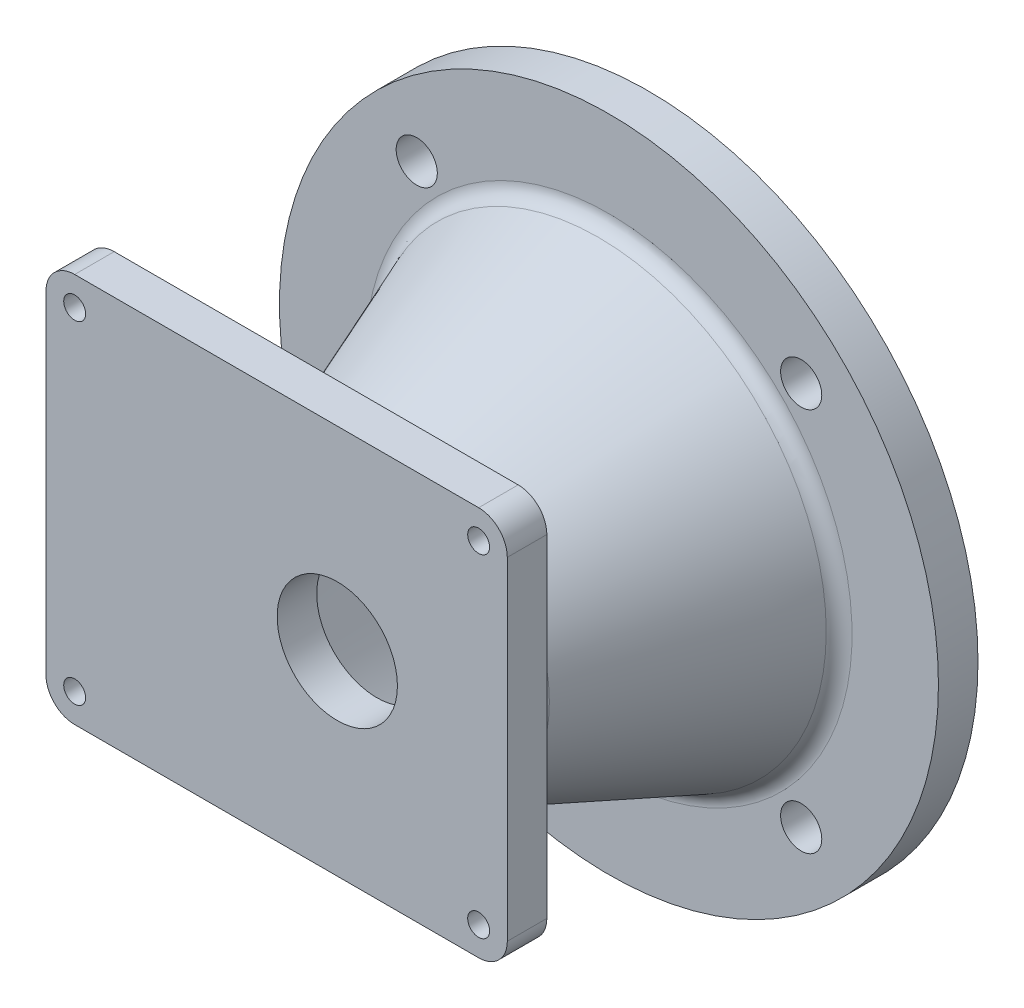
ISO-10303-21;
HEADER;
FILE_DESCRIPTION(('STEP AP214'),'2;1');
FILE_NAME('part.step','',(''),(''),'','','');
FILE_SCHEMA(('AUTOMOTIVE_DESIGN { 1 0 10303 214 1 1 1 1 }'));
ENDSEC;
DATA;
#1=APPLICATION_CONTEXT('core data for automotive mechanical design processes');
#2=APPLICATION_PROTOCOL_DEFINITION('international standard','automotive_design',2000,#1);
#3=PRODUCT_CONTEXT('',#1,'mechanical');
#4=PRODUCT('Part','Part','',(#3));
#5=PRODUCT_RELATED_PRODUCT_CATEGORY('part','',(#4));
#6=PRODUCT_DEFINITION_FORMATION('','',#4);
#7=PRODUCT_DEFINITION_CONTEXT('part definition',#1,'design');
#8=PRODUCT_DEFINITION('design','',#6,#7);
#9=PRODUCT_DEFINITION_SHAPE('','',#8);
#10=(LENGTH_UNIT() NAMED_UNIT(*) SI_UNIT(.MILLI.,.METRE.));
#11=(NAMED_UNIT(*) PLANE_ANGLE_UNIT() SI_UNIT($,.RADIAN.));
#12=(NAMED_UNIT(*) SI_UNIT($,.STERADIAN.) SOLID_ANGLE_UNIT());
#13=UNCERTAINTY_MEASURE_WITH_UNIT(LENGTH_MEASURE(1.E-05),#10,'distance_accuracy_value','');
#14=(GEOMETRIC_REPRESENTATION_CONTEXT(3) GLOBAL_UNCERTAINTY_ASSIGNED_CONTEXT((#13)) GLOBAL_UNIT_ASSIGNED_CONTEXT((#10,
#11,#12)) REPRESENTATION_CONTEXT('',''));
#15=CARTESIAN_POINT('',(0.,0.,0.));
#16=DIRECTION('',(0.,0.,1.));
#17=DIRECTION('',(1.,0.,0.));
#18=AXIS2_PLACEMENT_3D('',#15,#16,#17);
#19=CARTESIAN_POINT('',(125.399999999988,50.4499999999997,94.4500000000136));
#20=DIRECTION('',(0.,0.,-1.));
#21=DIRECTION('',(-1.,0.,0.));
#22=AXIS2_PLACEMENT_3D('',#19,#20,#21);
#23=CYLINDRICAL_SURFACE('',#22,8.69999999999994);
#24=CARTESIAN_POINT('',(125.399999999988,50.4499999999997,94.4500000000136));
#25=DIRECTION('',(0.,0.,-1.));
#26=DIRECTION('',(-1.,0.,0.));
#27=AXIS2_PLACEMENT_3D('',#24,#25,#26);
#28=CIRCLE('',#27,8.69999999999994);
#29=CARTESIAN_POINT('',(134.099999999988,50.4499999999997,94.4500000000136));
#30=VERTEX_POINT('',#29);
#31=CARTESIAN_POINT('',(125.399999999988,59.1499999999996,94.4500000000136));
#32=VERTEX_POINT('',#31);
#33=EDGE_CURVE('E21',#30,#32,#28,.F.);
#34=ORIENTED_EDGE('',*,*,#33,.F.);
#35=DIRECTION('',(0.,0.,-1.));
#36=VECTOR('',#35,1.);
#37=CARTESIAN_POINT('',(134.099999999988,50.4499999999997,94.4500000000136));
#38=LINE('',#37,#36);
#39=CARTESIAN_POINT('',(134.099999999988,50.4499999999997,82.4500000000136));
#40=VERTEX_POINT('',#39);
#41=EDGE_CURVE('E79',#40,#30,#38,.F.);
#42=ORIENTED_EDGE('',*,*,#41,.F.);
#43=CARTESIAN_POINT('',(125.399999999988,50.4499999999997,82.4500000000137));
#44=DIRECTION('',(0.,0.,-1.));
#45=DIRECTION('',(-1.,0.,0.));
#46=AXIS2_PLACEMENT_3D('',#43,#44,#45);
#47=CIRCLE('',#46,8.69999999999994);
#48=CARTESIAN_POINT('',(125.399999999988,59.1499999999996,82.4500000000136));
#49=VERTEX_POINT('',#48);
#50=EDGE_CURVE('E89',#49,#40,#47,.T.);
#51=ORIENTED_EDGE('',*,*,#50,.F.);
#52=DIRECTION('',(0.,0.,1.));
#53=VECTOR('',#52,1.);
#54=CARTESIAN_POINT('',(125.399999999988,59.1499999999996,94.4500000000136));
#55=LINE('',#54,#53);
#56=EDGE_CURVE('E84',#32,#49,#55,.F.);
#57=ORIENTED_EDGE('',*,*,#56,.F.);
#58=EDGE_LOOP('',(#34,#42,#51,#57));
#59=FACE_BOUND('',#58,.T.);
#60=ADVANCED_FACE('F17',(#59),#23,.T.);
#61=CARTESIAN_POINT('',(134.099999999988,-50.4499999999997,94.4500000000136));
#62=DIRECTION('',(1.,0.,0.));
#63=DIRECTION('',(0.,0.,-1.));
#64=AXIS2_PLACEMENT_3D('',#61,#62,#63);
#65=PLANE('',#64);
#66=DIRECTION('',(0.,1.,0.));
#67=VECTOR('',#66,1.);
#68=CARTESIAN_POINT('',(134.099999999988,0.,94.4500000000136));
#69=LINE('',#68,#67);
#70=CARTESIAN_POINT('',(134.099999999988,-50.4499999999997,94.4500000000136));
#71=VERTEX_POINT('',#70);
#72=EDGE_CURVE('E92',#71,#30,#69,.T.);
#73=ORIENTED_EDGE('',*,*,#72,.F.);
#74=DIRECTION('',(0.,0.,-1.));
#75=VECTOR('',#74,1.);
#76=CARTESIAN_POINT('',(134.099999999988,-50.4499999999997,94.4500000000136));
#77=LINE('',#76,#75);
#78=CARTESIAN_POINT('',(134.099999999988,-50.4499999999997,82.4500000000136));
#79=VERTEX_POINT('',#78);
#80=EDGE_CURVE('E116',#79,#71,#77,.F.);
#81=ORIENTED_EDGE('',*,*,#80,.F.);
#82=DIRECTION('',(0.,1.,0.));
#83=VECTOR('',#82,1.);
#84=CARTESIAN_POINT('',(134.099999999988,0.,82.4500000000136));
#85=LINE('',#84,#83);
#86=EDGE_CURVE('E191',#40,#79,#85,.F.);
#87=ORIENTED_EDGE('',*,*,#86,.F.);
#88=ORIENTED_EDGE('',*,*,#41,.T.);
#89=EDGE_LOOP('',(#73,#81,#87,#88));
#90=FACE_BOUND('',#89,.T.);
#91=ADVANCED_FACE('F328',(#90),#65,.T.);
#92=CARTESIAN_POINT('',(125.399999999988,-50.4499999999997,94.4500000000136));
#93=DIRECTION('',(0.,0.,-1.));
#94=DIRECTION('',(-1.,0.,0.));
#95=AXIS2_PLACEMENT_3D('',#92,#93,#94);
#96=CYLINDRICAL_SURFACE('',#95,8.69999999999994);
#97=CARTESIAN_POINT('',(125.399999999988,-50.4499999999997,94.4500000000136));
#98=DIRECTION('',(0.,0.,-1.));
#99=DIRECTION('',(-1.,0.,0.));
#100=AXIS2_PLACEMENT_3D('',#97,#98,#99);
#101=CIRCLE('',#100,8.69999999999994);
#102=CARTESIAN_POINT('',(125.399999999988,-59.1499999999996,94.4500000000136));
#103=VERTEX_POINT('',#102);
#104=EDGE_CURVE('E205',#103,#71,#101,.F.);
#105=ORIENTED_EDGE('',*,*,#104,.F.);
#106=DIRECTION('',(0.,0.,-1.));
#107=VECTOR('',#106,1.);
#108=CARTESIAN_POINT('',(125.399999999988,-59.1499999999996,94.4500000000136));
#109=LINE('',#108,#107);
#110=CARTESIAN_POINT('',(125.399999999988,-59.1499999999996,82.4500000000136));
#111=VERTEX_POINT('',#110);
#112=EDGE_CURVE('E114',#111,#103,#109,.F.);
#113=ORIENTED_EDGE('',*,*,#112,.F.);
#114=CARTESIAN_POINT('',(125.399999999988,-50.4499999999997,82.4500000000137));
#115=DIRECTION('',(0.,0.,-1.));
#116=DIRECTION('',(-1.,0.,0.));
#117=AXIS2_PLACEMENT_3D('',#114,#115,#116);
#118=CIRCLE('',#117,8.69999999999994);
#119=EDGE_CURVE('E188',#79,#111,#118,.T.);
#120=ORIENTED_EDGE('',*,*,#119,.F.);
#121=ORIENTED_EDGE('',*,*,#80,.T.);
#122=EDGE_LOOP('',(#105,#113,#120,#121));
#123=FACE_BOUND('',#122,.T.);
#124=ADVANCED_FACE('F331',(#123),#96,.T.);
#125=CARTESIAN_POINT('',(2.79999999998868,-59.1499999999996,94.4500000000136));
#126=DIRECTION('',(0.,-1.,0.));
#127=DIRECTION('',(0.,0.,-1.));
#128=AXIS2_PLACEMENT_3D('',#125,#126,#127);
#129=PLANE('',#128);
#130=DIRECTION('',(1.,0.,0.));
#131=VECTOR('',#130,1.);
#132=CARTESIAN_POINT('',(64.0999999999883,-59.1499999999996,94.4500000000136));
#133=LINE('',#132,#131);
#134=CARTESIAN_POINT('',(2.79999999998868,-59.1499999999996,94.4500000000136));
#135=VERTEX_POINT('',#134);
#136=EDGE_CURVE('E207',#135,#103,#133,.T.);
#137=ORIENTED_EDGE('',*,*,#136,.F.);
#138=DIRECTION('',(0.,0.,-1.));
#139=VECTOR('',#138,1.);
#140=CARTESIAN_POINT('',(2.79999999998868,-59.1499999999997,94.4500000000136));
#141=LINE('',#140,#139);
#142=CARTESIAN_POINT('',(2.79999999998868,-59.1499999999996,82.4500000000136));
#143=VERTEX_POINT('',#142);
#144=EDGE_CURVE('E112',#143,#135,#141,.F.);
#145=ORIENTED_EDGE('',*,*,#144,.F.);
#146=DIRECTION('',(-1.,0.,0.));
#147=VECTOR('',#146,1.);
#148=CARTESIAN_POINT('',(64.0999999999883,-59.1499999999996,82.4500000000136));
#149=LINE('',#148,#147);
#150=EDGE_CURVE('E187',#111,#143,#149,.T.);
#151=ORIENTED_EDGE('',*,*,#150,.F.);
#152=ORIENTED_EDGE('',*,*,#112,.T.);
#153=EDGE_LOOP('',(#137,#145,#151,#152));
#154=FACE_BOUND('',#153,.T.);
#155=ADVANCED_FACE('F334',(#154),#129,.T.);
#156=CARTESIAN_POINT('',(2.79999999998868,-50.4499999999997,94.4500000000136));
#157=DIRECTION('',(0.,0.,-1.));
#158=DIRECTION('',(-1.,0.,0.));
#159=AXIS2_PLACEMENT_3D('',#156,#157,#158);
#160=CYLINDRICAL_SURFACE('',#159,8.69999999999994);
#161=CARTESIAN_POINT('',(2.79999999998868,-50.4499999999997,94.4500000000136));
#162=DIRECTION('',(0.,0.,-1.));
#163=DIRECTION('',(-1.,0.,0.));
#164=AXIS2_PLACEMENT_3D('',#161,#162,#163);
#165=CIRCLE('',#164,8.69999999999994);
#166=CARTESIAN_POINT('',(-5.90000000001123,-50.4499999999997,94.4500000000136));
#167=VERTEX_POINT('',#166);
#168=EDGE_CURVE('E208',#167,#135,#165,.F.);
#169=ORIENTED_EDGE('',*,*,#168,.F.);
#170=DIRECTION('',(0.,0.,1.));
#171=VECTOR('',#170,1.);
#172=CARTESIAN_POINT('',(-5.90000000001123,-50.4499999999997,94.4500000000136));
#173=LINE('',#172,#171);
#174=CARTESIAN_POINT('',(-5.90000000001125,-50.4499999999997,82.4500000000136));
#175=VERTEX_POINT('',#174);
#176=EDGE_CURVE('E110',#175,#167,#173,.T.);
#177=ORIENTED_EDGE('',*,*,#176,.F.);
#178=CARTESIAN_POINT('',(2.79999999998868,-50.4499999999997,82.4500000000137));
#179=DIRECTION('',(0.,0.,-1.));
#180=DIRECTION('',(-1.,0.,0.));
#181=AXIS2_PLACEMENT_3D('',#178,#179,#180);
#182=CIRCLE('',#181,8.69999999999994);
#183=EDGE_CURVE('E184',#143,#175,#182,.T.);
#184=ORIENTED_EDGE('',*,*,#183,.F.);
#185=ORIENTED_EDGE('',*,*,#144,.T.);
#186=EDGE_LOOP('',(#169,#177,#184,#185));
#187=FACE_BOUND('',#186,.T.);
#188=ADVANCED_FACE('F338',(#187),#160,.T.);
#189=CARTESIAN_POINT('',(-5.90000000001123,50.4499999999997,94.4500000000136));
#190=DIRECTION('',(-1.,0.,0.));
#191=DIRECTION('',(0.,0.,1.));
#192=AXIS2_PLACEMENT_3D('',#189,#190,#191);
#193=PLANE('',#192);
#194=DIRECTION('',(0.,1.,0.));
#195=VECTOR('',#194,1.);
#196=CARTESIAN_POINT('',(-5.90000000001123,0.,94.4500000000136));
#197=LINE('',#196,#195);
#198=CARTESIAN_POINT('',(-5.90000000001123,50.4499999999997,94.4500000000136));
#199=VERTEX_POINT('',#198);
#200=EDGE_CURVE('E210',#199,#167,#197,.F.);
#201=ORIENTED_EDGE('',*,*,#200,.F.);
#202=DIRECTION('',(0.,0.,-1.));
#203=VECTOR('',#202,1.);
#204=CARTESIAN_POINT('',(-5.90000000001123,50.4499999999997,94.4500000000136));
#205=LINE('',#204,#203);
#206=CARTESIAN_POINT('',(-5.90000000001125,50.4499999999997,82.4500000000136));
#207=VERTEX_POINT('',#206);
#208=EDGE_CURVE('E107',#207,#199,#205,.F.);
#209=ORIENTED_EDGE('',*,*,#208,.F.);
#210=DIRECTION('',(0.,1.,0.));
#211=VECTOR('',#210,1.);
#212=CARTESIAN_POINT('',(-5.90000000001126,0.,82.4500000000136));
#213=LINE('',#212,#211);
#214=EDGE_CURVE('E183',#175,#207,#213,.T.);
#215=ORIENTED_EDGE('',*,*,#214,.F.);
#216=ORIENTED_EDGE('',*,*,#176,.T.);
#217=EDGE_LOOP('',(#201,#209,#215,#216));
#218=FACE_BOUND('',#217,.T.);
#219=ADVANCED_FACE('F342',(#218),#193,.T.);
#220=CARTESIAN_POINT('',(2.79999999998871,50.4499999999997,94.4500000000136));
#221=DIRECTION('',(0.,0.,-1.));
#222=DIRECTION('',(-1.,0.,0.));
#223=AXIS2_PLACEMENT_3D('',#220,#221,#222);
#224=CYLINDRICAL_SURFACE('',#223,8.69999999999994);
#225=CARTESIAN_POINT('',(2.79999999998871,50.4499999999997,94.4500000000136));
#226=DIRECTION('',(0.,0.,-1.));
#227=DIRECTION('',(-1.,0.,0.));
#228=AXIS2_PLACEMENT_3D('',#225,#226,#227);
#229=CIRCLE('',#228,8.69999999999994);
#230=CARTESIAN_POINT('',(2.79999999998871,59.1499999999996,94.4500000000136));
#231=VERTEX_POINT('',#230);
#232=EDGE_CURVE('E99',#231,#199,#229,.F.);
#233=ORIENTED_EDGE('',*,*,#232,.F.);
#234=DIRECTION('',(0.,0.,1.));
#235=VECTOR('',#234,1.);
#236=CARTESIAN_POINT('',(2.79999999998871,59.1499999999996,94.4500000000136));
#237=LINE('',#236,#235);
#238=CARTESIAN_POINT('',(2.79999999998871,59.1499999999996,82.4500000000136));
#239=VERTEX_POINT('',#238);
#240=EDGE_CURVE('E36',#239,#231,#237,.T.);
#241=ORIENTED_EDGE('',*,*,#240,.F.);
#242=CARTESIAN_POINT('',(2.79999999998871,50.4499999999997,82.4500000000136));
#243=DIRECTION('',(0.,0.,-1.));
#244=DIRECTION('',(-1.,0.,0.));
#245=AXIS2_PLACEMENT_3D('',#242,#243,#244);
#246=CIRCLE('',#245,8.69999999999994);
#247=EDGE_CURVE('E180',#207,#239,#246,.T.);
#248=ORIENTED_EDGE('',*,*,#247,.F.);
#249=ORIENTED_EDGE('',*,*,#208,.T.);
#250=EDGE_LOOP('',(#233,#241,#248,#249));
#251=FACE_BOUND('',#250,.T.);
#252=ADVANCED_FACE('F346',(#251),#224,.T.);
#253=CARTESIAN_POINT('',(125.399999999988,59.1499999999996,94.4500000000136));
#254=DIRECTION('',(0.,1.,0.));
#255=DIRECTION('',(0.,0.,1.));
#256=AXIS2_PLACEMENT_3D('',#253,#254,#255);
#257=PLANE('',#256);
#258=DIRECTION('',(1.,0.,0.));
#259=VECTOR('',#258,1.);
#260=CARTESIAN_POINT('',(64.0999999999883,59.1499999999996,94.4500000000136));
#261=LINE('',#260,#259);
#262=EDGE_CURVE('E95',#32,#231,#261,.F.);
#263=ORIENTED_EDGE('',*,*,#262,.F.);
#264=ORIENTED_EDGE('',*,*,#56,.T.);
#265=DIRECTION('',(-1.,0.,0.));
#266=VECTOR('',#265,1.);
#267=CARTESIAN_POINT('',(64.0999999999883,59.1499999999996,82.4500000000136));
#268=LINE('',#267,#266);
#269=EDGE_CURVE('E179',#239,#49,#268,.F.);
#270=ORIENTED_EDGE('',*,*,#269,.F.);
#271=ORIENTED_EDGE('',*,*,#240,.T.);
#272=EDGE_LOOP('',(#263,#264,#270,#271));
#273=FACE_BOUND('',#272,.T.);
#274=ADVANCED_FACE('F96',(#273),#257,.T.);
#275=CARTESIAN_POINT('',(2.79999999998871,50.4499999999997,82.4500000000136));
#276=DIRECTION('',(0.,0.,1.));
#277=DIRECTION('',(1.,0.,0.));
#278=AXIS2_PLACEMENT_3D('',#275,#276,#277);
#279=CYLINDRICAL_SURFACE('',#278,3.32349999999999);
#280=CARTESIAN_POINT('',(2.79999999998871,50.4499999999997,94.4500000000136));
#281=DIRECTION('',(0.,0.,1.));
#282=DIRECTION('',(1.,0.,0.));
#283=AXIS2_PLACEMENT_3D('',#280,#281,#282);
#284=CIRCLE('',#283,3.32349999999999);
#285=CARTESIAN_POINT('',(6.1234999999887,50.4499999999997,94.4500000000136));
#286=VERTEX_POINT('',#285);
#287=EDGE_CURVE('E202',#286,#286,#284,.F.);
#288=ORIENTED_EDGE('',*,*,#287,.F.);
#289=EDGE_LOOP('',(#288));
#290=FACE_BOUND('',#289,.T.);
#291=CARTESIAN_POINT('',(2.79999999998871,50.4499999999997,82.4500000000136));
#292=DIRECTION('',(0.,0.,1.));
#293=DIRECTION('',(1.,0.,0.));
#294=AXIS2_PLACEMENT_3D('',#291,#292,#293);
#295=CIRCLE('',#294,3.32349999999999);
#296=CARTESIAN_POINT('',(6.1234999999887,50.4499999999997,82.4500000000136));
#297=VERTEX_POINT('',#296);
#298=EDGE_CURVE('E176',#297,#297,#295,.T.);
#299=ORIENTED_EDGE('',*,*,#298,.F.);
#300=EDGE_LOOP('',(#299));
#301=FACE_BOUND('',#300,.T.);
#302=ADVANCED_FACE('F321',(#290,#301),#279,.F.);
#303=CARTESIAN_POINT('',(125.399999999988,-50.4499999999997,82.4500000000136));
#304=DIRECTION('',(0.,0.,1.));
#305=DIRECTION('',(1.,0.,0.));
#306=AXIS2_PLACEMENT_3D('',#303,#304,#305);
#307=CYLINDRICAL_SURFACE('',#306,3.32350000000001);
#308=CARTESIAN_POINT('',(125.399999999988,-50.4499999999997,94.4500000000136));
#309=DIRECTION('',(0.,0.,1.));
#310=DIRECTION('',(1.,0.,0.));
#311=AXIS2_PLACEMENT_3D('',#308,#309,#310);
#312=CIRCLE('',#311,3.32350000000001);
#313=CARTESIAN_POINT('',(128.723499999988,-50.4499999999997,94.4500000000136));
#314=VERTEX_POINT('',#313);
#315=EDGE_CURVE('E199',#314,#314,#312,.F.);
#316=ORIENTED_EDGE('',*,*,#315,.F.);
#317=EDGE_LOOP('',(#316));
#318=FACE_BOUND('',#317,.T.);
#319=CARTESIAN_POINT('',(125.399999999988,-50.4499999999997,82.4500000000136));
#320=DIRECTION('',(0.,0.,1.));
#321=DIRECTION('',(1.,0.,0.));
#322=AXIS2_PLACEMENT_3D('',#319,#320,#321);
#323=CIRCLE('',#322,3.32350000000001);
#324=CARTESIAN_POINT('',(128.723499999988,-50.4499999999997,82.4500000000136));
#325=VERTEX_POINT('',#324);
#326=EDGE_CURVE('E173',#325,#325,#323,.T.);
#327=ORIENTED_EDGE('',*,*,#326,.F.);
#328=EDGE_LOOP('',(#327));
#329=FACE_BOUND('',#328,.T.);
#330=ADVANCED_FACE('F317',(#318,#329),#307,.F.);
#331=CARTESIAN_POINT('',(125.399999999988,50.4499999999997,82.4500000000136));
#332=DIRECTION('',(0.,0.,1.));
#333=DIRECTION('',(1.,0.,0.));
#334=AXIS2_PLACEMENT_3D('',#331,#332,#333);
#335=CYLINDRICAL_SURFACE('',#334,3.3235);
#336=CARTESIAN_POINT('',(125.399999999988,50.4499999999997,94.4500000000136));
#337=DIRECTION('',(0.,0.,1.));
#338=DIRECTION('',(1.,0.,0.));
#339=AXIS2_PLACEMENT_3D('',#336,#337,#338);
#340=CIRCLE('',#339,3.3235);
#341=CARTESIAN_POINT('',(128.723499999988,50.4499999999997,94.4500000000136));
#342=VERTEX_POINT('',#341);
#343=EDGE_CURVE('E196',#342,#342,#340,.F.);
#344=ORIENTED_EDGE('',*,*,#343,.F.);
#345=EDGE_LOOP('',(#344));
#346=FACE_BOUND('',#345,.T.);
#347=CARTESIAN_POINT('',(125.399999999988,50.4499999999997,82.4500000000136));
#348=DIRECTION('',(0.,0.,1.));
#349=DIRECTION('',(1.,0.,0.));
#350=AXIS2_PLACEMENT_3D('',#347,#348,#349);
#351=CIRCLE('',#350,3.3235);
#352=CARTESIAN_POINT('',(128.723499999988,50.4499999999997,82.4500000000136));
#353=VERTEX_POINT('',#352);
#354=EDGE_CURVE('E170',#353,#353,#351,.T.);
#355=ORIENTED_EDGE('',*,*,#354,.F.);
#356=EDGE_LOOP('',(#355));
#357=FACE_BOUND('',#356,.T.);
#358=ADVANCED_FACE('F313',(#346,#357),#335,.F.);
#359=CARTESIAN_POINT('',(2.79999999998868,-50.4499999999997,82.4500000000136));
#360=DIRECTION('',(0.,0.,1.));
#361=DIRECTION('',(1.,0.,0.));
#362=AXIS2_PLACEMENT_3D('',#359,#360,#361);
#363=CYLINDRICAL_SURFACE('',#362,3.32350000000001);
#364=CARTESIAN_POINT('',(2.79999999998868,-50.4499999999997,94.4500000000136));
#365=DIRECTION('',(0.,0.,1.));
#366=DIRECTION('',(1.,0.,0.));
#367=AXIS2_PLACEMENT_3D('',#364,#365,#366);
#368=CIRCLE('',#367,3.32350000000001);
#369=CARTESIAN_POINT('',(6.12349999998868,-50.4499999999997,94.4500000000136));
#370=VERTEX_POINT('',#369);
#371=EDGE_CURVE('E193',#370,#370,#368,.F.);
#372=ORIENTED_EDGE('',*,*,#371,.F.);
#373=EDGE_LOOP('',(#372));
#374=FACE_BOUND('',#373,.T.);
#375=CARTESIAN_POINT('',(2.79999999998868,-50.4499999999997,82.4500000000136));
#376=DIRECTION('',(0.,0.,1.));
#377=DIRECTION('',(1.,0.,0.));
#378=AXIS2_PLACEMENT_3D('',#375,#376,#377);
#379=CIRCLE('',#378,3.32350000000001);
#380=CARTESIAN_POINT('',(6.12349999998868,-50.4499999999997,82.4500000000136));
#381=VERTEX_POINT('',#380);
#382=EDGE_CURVE('E167',#381,#381,#379,.T.);
#383=ORIENTED_EDGE('',*,*,#382,.F.);
#384=EDGE_LOOP('',(#383));
#385=FACE_BOUND('',#384,.T.);
#386=ADVANCED_FACE('F310',(#374,#385),#363,.F.);
#387=CARTESIAN_POINT('',(64.0999999999883,0.,94.4500000000136));
#388=DIRECTION('',(0.,0.,1.));
#389=DIRECTION('',(1.,0.,0.));
#390=AXIS2_PLACEMENT_3D('',#387,#388,#389);
#391=PLANE('',#390);
#392=CARTESIAN_POINT('',(82.4999999999881,0.,94.4500000000136));
#393=DIRECTION('',(0.,0.,1.));
#394=DIRECTION('',(1.,0.,0.));
#395=AXIS2_PLACEMENT_3D('',#392,#393,#394);
#396=CIRCLE('',#395,18.2499999999999);
#397=CARTESIAN_POINT('',(100.749999999988,0.,94.4500000000136));
#398=VERTEX_POINT('',#397);
#399=EDGE_CURVE('E164',#398,#398,#396,.T.);
#400=ORIENTED_EDGE('',*,*,#399,.F.);
#401=EDGE_LOOP('',(#400));
#402=FACE_BOUND('',#401,.T.);
#403=ORIENTED_EDGE('',*,*,#371,.T.);
#404=EDGE_LOOP('',(#403));
#405=FACE_BOUND('',#404,.T.);
#406=ORIENTED_EDGE('',*,*,#343,.T.);
#407=EDGE_LOOP('',(#406));
#408=FACE_BOUND('',#407,.T.);
#409=ORIENTED_EDGE('',*,*,#315,.T.);
#410=EDGE_LOOP('',(#409));
#411=FACE_BOUND('',#410,.T.);
#412=ORIENTED_EDGE('',*,*,#287,.T.);
#413=EDGE_LOOP('',(#412));
#414=FACE_BOUND('',#413,.T.);
#415=ORIENTED_EDGE('',*,*,#136,.T.);
#416=ORIENTED_EDGE('',*,*,#104,.T.);
#417=ORIENTED_EDGE('',*,*,#72,.T.);
#418=ORIENTED_EDGE('',*,*,#33,.T.);
#419=ORIENTED_EDGE('',*,*,#262,.T.);
#420=ORIENTED_EDGE('',*,*,#232,.T.);
#421=ORIENTED_EDGE('',*,*,#200,.T.);
#422=ORIENTED_EDGE('',*,*,#168,.T.);
#423=EDGE_LOOP('',(#415,#416,#417,#418,#419,#420,#421,#422));
#424=FACE_BOUND('',#423,.T.);
#425=ADVANCED_FACE('F102',(#402,#405,#408,#411,#414,#424),#391,.T.);
#426=CARTESIAN_POINT('',(64.0999999999883,0.,82.4500000000136));
#427=DIRECTION('',(0.,0.,-1.));
#428=DIRECTION('',(-1.,0.,0.));
#429=AXIS2_PLACEMENT_3D('',#426,#427,#428);
#430=PLANE('',#429);
#431=CARTESIAN_POINT('',(82.4999999999881,1.04581818583889E-13,82.4500000000137));
#432=DIRECTION('',(0.,0.,1.));
#433=DIRECTION('',(1.,0.,0.));
#434=AXIS2_PLACEMENT_3D('',#431,#432,#433);
#435=CIRCLE('',#434,50.2159316167503);
#436=CARTESIAN_POINT('',(132.715931616738,1.04581818583889E-13,82.4500000000137));
#437=VERTEX_POINT('',#436);
#438=EDGE_CURVE('E161',#437,#437,#435,.F.);
#439=ORIENTED_EDGE('',*,*,#438,.F.);
#440=EDGE_LOOP('',(#439));
#441=FACE_BOUND('',#440,.T.);
#442=ORIENTED_EDGE('',*,*,#382,.T.);
#443=EDGE_LOOP('',(#442));
#444=FACE_BOUND('',#443,.T.);
#445=ORIENTED_EDGE('',*,*,#354,.T.);
#446=EDGE_LOOP('',(#445));
#447=FACE_BOUND('',#446,.T.);
#448=ORIENTED_EDGE('',*,*,#326,.T.);
#449=EDGE_LOOP('',(#448));
#450=FACE_BOUND('',#449,.T.);
#451=ORIENTED_EDGE('',*,*,#298,.T.);
#452=EDGE_LOOP('',(#451));
#453=FACE_BOUND('',#452,.T.);
#454=ORIENTED_EDGE('',*,*,#247,.T.);
#455=ORIENTED_EDGE('',*,*,#269,.T.);
#456=ORIENTED_EDGE('',*,*,#50,.T.);
#457=ORIENTED_EDGE('',*,*,#86,.T.);
#458=ORIENTED_EDGE('',*,*,#119,.T.);
#459=ORIENTED_EDGE('',*,*,#150,.T.);
#460=ORIENTED_EDGE('',*,*,#183,.T.);
#461=ORIENTED_EDGE('',*,*,#214,.T.);
#462=EDGE_LOOP('',(#454,#455,#456,#457,#458,#459,#460,#461));
#463=FACE_BOUND('',#462,.T.);
#464=ADVANCED_FACE('F354',(#441,#444,#447,#450,#453,#463),#430,.T.);
#465=CARTESIAN_POINT('',(82.4999999999881,0.,82.4500000000136));
#466=DIRECTION('',(0.,0.,1.));
#467=DIRECTION('',(1.,0.,0.));
#468=AXIS2_PLACEMENT_3D('',#465,#466,#467);
#469=CYLINDRICAL_SURFACE('',#468,18.2499999999999);
#470=ORIENTED_EDGE('',*,*,#399,.T.);
#471=EDGE_LOOP('',(#470));
#472=FACE_BOUND('',#471,.T.);
#473=CARTESIAN_POINT('',(82.4999999999881,0.,82.4500000000136));
#474=DIRECTION('',(0.,0.,1.));
#475=DIRECTION('',(1.,0.,0.));
#476=AXIS2_PLACEMENT_3D('',#473,#474,#475);
#477=CIRCLE('',#476,18.2499999999999);
#478=CARTESIAN_POINT('',(100.749999999988,0.,82.4500000000136));
#479=VERTEX_POINT('',#478);
#480=EDGE_CURVE('E158',#479,#479,#477,.T.);
#481=ORIENTED_EDGE('',*,*,#480,.F.);
#482=EDGE_LOOP('',(#481));
#483=FACE_BOUND('',#482,.T.);
#484=ADVANCED_FACE('F252',(#472,#483),#469,.F.);
#485=CARTESIAN_POINT('',(82.4999999999881,1.04581818583889E-13,77.4500000000136));
#486=DIRECTION('',(0.,0.,1.));
#487=DIRECTION('',(1.,0.,0.));
#488=AXIS2_PLACEMENT_3D('',#485,#486,#487);
#489=TOROIDAL_SURFACE('',#488,50.2159316167502,5.00000000000012);
#490=ORIENTED_EDGE('',*,*,#438,.T.);
#491=EDGE_LOOP('',(#490));
#492=FACE_BOUND('',#491,.T.);
#493=CARTESIAN_POINT('',(82.4999999999881,0.,75.6337864807112));
#494=DIRECTION('',(0.,0.,-1.));
#495=DIRECTION('',(1.,0.,0.));
#496=AXIS2_PLACEMENT_3D('',#493,#494,#495);
#497=CIRCLE('',#496,45.5574590646423);
#498=CARTESIAN_POINT('',(128.05745906463,0.,75.6337864807112));
#499=VERTEX_POINT('',#498);
#500=EDGE_CURVE('E157',#499,#499,#497,.T.);
#501=ORIENTED_EDGE('',*,*,#500,.F.);
#502=EDGE_LOOP('',(#501));
#503=FACE_BOUND('',#502,.T.);
#504=ADVANCED_FACE('F242',(#492,#503),#489,.F.);
#505=CARTESIAN_POINT('',(64.0999999999883,0.,82.4500000000136));
#506=DIRECTION('',(0.,0.,-1.));
#507=DIRECTION('',(-1.,0.,0.));
#508=AXIS2_PLACEMENT_3D('',#505,#506,#507);
#509=PLANE('',#508);
#510=ORIENTED_EDGE('',*,*,#480,.T.);
#511=EDGE_LOOP('',(#510));
#512=FACE_BOUND('',#511,.T.);
#513=CARTESIAN_POINT('',(82.4999999999881,0.,82.4500000000136));
#514=DIRECTION('',(0.,0.,-1.));
#515=DIRECTION('',(-1.,0.,0.));
#516=AXIS2_PLACEMENT_3D('',#513,#514,#515);
#517=CIRCLE('',#516,37.5334342955592);
#518=CARTESIAN_POINT('',(44.9665657044289,0.,82.4500000000136));
#519=VERTEX_POINT('',#518);
#520=EDGE_CURVE('E153',#519,#519,#517,.F.);
#521=ORIENTED_EDGE('',*,*,#520,.F.);
#522=EDGE_LOOP('',(#521));
#523=FACE_BOUND('',#522,.T.);
#524=ADVANCED_FACE('F240',(#512,#523),#509,.T.);
#525=CARTESIAN_POINT('',(82.4999999999881,0.,75.6337864807112));
#526=DIRECTION('',(0.,0.,-1.));
#527=DIRECTION('',(0.,1.,0.));
#528=AXIS2_PLACEMENT_3D('',#525,#526,#527);
#529=CONICAL_SURFACE('',#528,45.5574590646423,0.371745987668824);
#530=ORIENTED_EDGE('',*,*,#500,.T.);
#531=EDGE_LOOP('',(#530));
#532=FACE_BOUND('',#531,.T.);
#533=CARTESIAN_POINT('',(82.4999999999881,1.00229599271483E-12,15.1837864104625));
#534=DIRECTION('',(0.,0.,-1.));
#535=DIRECTION('',(-1.,0.,0.));
#536=AXIS2_PLACEMENT_3D('',#533,#534,#535);
#537=CIRCLE('',#536,69.125292764329);
#538=CARTESIAN_POINT('',(13.3747072356591,1.00229599271483E-12,15.1837864104625));
#539=VERTEX_POINT('',#538);
#540=EDGE_CURVE('E156',#539,#539,#537,.T.);
#541=ORIENTED_EDGE('',*,*,#540,.F.);
#542=EDGE_LOOP('',(#541));
#543=FACE_BOUND('',#542,.T.);
#544=ADVANCED_FACE('F236',(#532,#543),#529,.T.);
#545=CARTESIAN_POINT('',(82.4999999999881,0.,82.4500000000136));
#546=DIRECTION('',(0.,0.,-1.));
#547=DIRECTION('',(-1.,0.,0.));
#548=AXIS2_PLACEMENT_3D('',#545,#546,#547);
#549=CONICAL_SURFACE('',#548,37.5334342955592,0.371745994010126);
#550=CARTESIAN_POINT('',(82.5000000000012,0.,12.));
#551=DIRECTION('',(0.,0.,1.));
#552=DIRECTION('',(-1.,0.,0.));
#553=AXIS2_PLACEMENT_3D('',#550,#551,#552);
#554=CIRCLE('',#553,65.0000000000012);
#555=CARTESIAN_POINT('',(17.5,0.,12.));
#556=VERTEX_POINT('',#555);
#557=EDGE_CURVE('E152',#556,#556,#554,.T.);
#558=ORIENTED_EDGE('',*,*,#557,.F.);
#559=EDGE_LOOP('',(#558));
#560=FACE_BOUND('',#559,.T.);
#561=ORIENTED_EDGE('',*,*,#520,.T.);
#562=EDGE_LOOP('',(#561));
#563=FACE_BOUND('',#562,.T.);
#564=ADVANCED_FACE('F232',(#560,#563),#549,.F.);
#565=CARTESIAN_POINT('',(82.4999999999881,0.,16.9999999999996));
#566=DIRECTION('',(0.,0.,-1.));
#567=DIRECTION('',(-1.,0.,0.));
#568=AXIS2_PLACEMENT_3D('',#565,#566,#567);
#569=TOROIDAL_SURFACE('',#568,73.7837654965848,4.9999999999999);
#570=CARTESIAN_POINT('',(82.4999999999881,0.,11.9999999999997));
#571=DIRECTION('',(0.,0.,-1.));
#572=DIRECTION('',(-1.,0.,0.));
#573=AXIS2_PLACEMENT_3D('',#570,#571,#572);
#574=CIRCLE('',#573,73.7837654965851);
#575=CARTESIAN_POINT('',(8.71623450340303,0.,11.9999999999997));
#576=VERTEX_POINT('',#575);
#577=EDGE_CURVE('E137',#576,#576,#574,.T.);
#578=ORIENTED_EDGE('',*,*,#577,.F.);
#579=EDGE_LOOP('',(#578));
#580=FACE_BOUND('',#579,.T.);
#581=ORIENTED_EDGE('',*,*,#540,.T.);
#582=EDGE_LOOP('',(#581));
#583=FACE_BOUND('',#582,.T.);
#584=ADVANCED_FACE('F235',(#580,#583),#569,.F.);
#585=CARTESIAN_POINT('',(140.836309447892,58.3363094478899,0.));
#586=DIRECTION('',(0.,0.,1.));
#587=DIRECTION('',(1.,0.,0.));
#588=AXIS2_PLACEMENT_3D('',#585,#586,#587);
#589=CYLINDRICAL_SURFACE('',#588,6.25);
#590=CARTESIAN_POINT('',(140.836309447892,58.3363094478899,12.));
#591=DIRECTION('',(0.,0.,1.));
#592=DIRECTION('',(1.,0.,0.));
#593=AXIS2_PLACEMENT_3D('',#590,#591,#592);
#594=CIRCLE('',#593,6.25);
#595=CARTESIAN_POINT('',(147.086309447892,58.3363094478899,12.));
#596=VERTEX_POINT('',#595);
#597=EDGE_CURVE('E140',#596,#596,#594,.F.);
#598=ORIENTED_EDGE('',*,*,#597,.F.);
#599=EDGE_LOOP('',(#598));
#600=FACE_BOUND('',#599,.T.);
#601=CARTESIAN_POINT('',(140.836309447892,58.3363094478899,0.));
#602=DIRECTION('',(0.,0.,1.));
#603=DIRECTION('',(1.,0.,0.));
#604=AXIS2_PLACEMENT_3D('',#601,#602,#603);
#605=CIRCLE('',#604,6.25);
#606=CARTESIAN_POINT('',(147.086309447892,58.3363094478899,0.));
#607=VERTEX_POINT('',#606);
#608=EDGE_CURVE('E134',#607,#607,#605,.T.);
#609=ORIENTED_EDGE('',*,*,#608,.F.);
#610=EDGE_LOOP('',(#609));
#611=FACE_BOUND('',#610,.T.);
#612=ADVANCED_FACE('F296',(#600,#611),#589,.F.);
#613=CARTESIAN_POINT('',(24.1636905521108,58.3363094478899,0.));
#614=DIRECTION('',(0.,0.,1.));
#615=DIRECTION('',(1.,0.,0.));
#616=AXIS2_PLACEMENT_3D('',#613,#614,#615);
#617=CYLINDRICAL_SURFACE('',#616,6.25);
#618=CARTESIAN_POINT('',(24.1636905521108,58.3363094478899,12.));
#619=DIRECTION('',(0.,0.,1.));
#620=DIRECTION('',(1.,0.,0.));
#621=AXIS2_PLACEMENT_3D('',#618,#619,#620);
#622=CIRCLE('',#621,6.25);
#623=CARTESIAN_POINT('',(30.4136905521108,58.3363094478899,12.));
#624=VERTEX_POINT('',#623);
#625=EDGE_CURVE('E143',#624,#624,#622,.F.);
#626=ORIENTED_EDGE('',*,*,#625,.F.);
#627=EDGE_LOOP('',(#626));
#628=FACE_BOUND('',#627,.T.);
#629=CARTESIAN_POINT('',(24.1636905521108,58.3363094478899,0.));
#630=DIRECTION('',(0.,0.,1.));
#631=DIRECTION('',(1.,0.,0.));
#632=AXIS2_PLACEMENT_3D('',#629,#630,#631);
#633=CIRCLE('',#632,6.25);
#634=CARTESIAN_POINT('',(30.4136905521108,58.3363094478899,0.));
#635=VERTEX_POINT('',#634);
#636=EDGE_CURVE('E131',#635,#635,#633,.T.);
#637=ORIENTED_EDGE('',*,*,#636,.F.);
#638=EDGE_LOOP('',(#637));
#639=FACE_BOUND('',#638,.T.);
#640=ADVANCED_FACE('F281',(#628,#639),#617,.F.);
#641=CARTESIAN_POINT('',(140.836309447892,-58.3363094478899,0.));
#642=DIRECTION('',(0.,0.,1.));
#643=DIRECTION('',(1.,0.,0.));
#644=AXIS2_PLACEMENT_3D('',#641,#642,#643);
#645=CYLINDRICAL_SURFACE('',#644,6.24999999999999);
#646=CARTESIAN_POINT('',(140.836309447892,-58.3363094478899,12.));
#647=DIRECTION('',(0.,0.,1.));
#648=DIRECTION('',(1.,0.,0.));
#649=AXIS2_PLACEMENT_3D('',#646,#647,#648);
#650=CIRCLE('',#649,6.24999999999999);
#651=CARTESIAN_POINT('',(147.086309447892,-58.3363094478899,12.));
#652=VERTEX_POINT('',#651);
#653=EDGE_CURVE('E146',#652,#652,#650,.F.);
#654=ORIENTED_EDGE('',*,*,#653,.F.);
#655=EDGE_LOOP('',(#654));
#656=FACE_BOUND('',#655,.T.);
#657=CARTESIAN_POINT('',(140.836309447892,-58.3363094478899,0.));
#658=DIRECTION('',(0.,0.,1.));
#659=DIRECTION('',(1.,0.,0.));
#660=AXIS2_PLACEMENT_3D('',#657,#658,#659);
#661=CIRCLE('',#660,6.24999999999999);
#662=CARTESIAN_POINT('',(147.086309447892,-58.3363094478899,0.));
#663=VERTEX_POINT('',#662);
#664=EDGE_CURVE('E128',#663,#663,#661,.T.);
#665=ORIENTED_EDGE('',*,*,#664,.F.);
#666=EDGE_LOOP('',(#665));
#667=FACE_BOUND('',#666,.T.);
#668=ADVANCED_FACE('F276',(#656,#667),#645,.F.);
#669=CARTESIAN_POINT('',(24.1636905521108,-58.3363094478899,0.));
#670=DIRECTION('',(0.,0.,1.));
#671=DIRECTION('',(1.,0.,0.));
#672=AXIS2_PLACEMENT_3D('',#669,#670,#671);
#673=CYLINDRICAL_SURFACE('',#672,6.24999999999999);
#674=CARTESIAN_POINT('',(24.1636905521108,-58.3363094478899,12.));
#675=DIRECTION('',(0.,0.,1.));
#676=DIRECTION('',(1.,0.,0.));
#677=AXIS2_PLACEMENT_3D('',#674,#675,#676);
#678=CIRCLE('',#677,6.24999999999999);
#679=CARTESIAN_POINT('',(30.4136905521108,-58.3363094478899,12.));
#680=VERTEX_POINT('',#679);
#681=EDGE_CURVE('E149',#680,#680,#678,.F.);
#682=ORIENTED_EDGE('',*,*,#681,.F.);
#683=EDGE_LOOP('',(#682));
#684=FACE_BOUND('',#683,.T.);
#685=CARTESIAN_POINT('',(24.1636905521108,-58.3363094478899,0.));
#686=DIRECTION('',(0.,0.,1.));
#687=DIRECTION('',(1.,0.,0.));
#688=AXIS2_PLACEMENT_3D('',#685,#686,#687);
#689=CIRCLE('',#688,6.24999999999999);
#690=CARTESIAN_POINT('',(30.4136905521108,-58.3363094478899,0.));
#691=VERTEX_POINT('',#690);
#692=EDGE_CURVE('E125',#691,#691,#689,.T.);
#693=ORIENTED_EDGE('',*,*,#692,.F.);
#694=EDGE_LOOP('',(#693));
#695=FACE_BOUND('',#694,.T.);
#696=ADVANCED_FACE('F19',(#684,#695),#673,.F.);
#697=CARTESIAN_POINT('',(82.5000000000012,0.,0.));
#698=DIRECTION('',(0.,0.,1.));
#699=DIRECTION('',(1.,0.,0.));
#700=AXIS2_PLACEMENT_3D('',#697,#698,#699);
#701=CYLINDRICAL_SURFACE('',#700,65.0000000000012);
#702=ORIENTED_EDGE('',*,*,#557,.T.);
#703=EDGE_LOOP('',(#702));
#704=FACE_BOUND('',#703,.T.);
#705=CARTESIAN_POINT('',(82.5000000000012,0.,0.));
#706=DIRECTION('',(0.,0.,1.));
#707=DIRECTION('',(1.,0.,0.));
#708=AXIS2_PLACEMENT_3D('',#705,#706,#707);
#709=CIRCLE('',#708,65.0000000000012);
#710=CARTESIAN_POINT('',(147.500000000002,0.,0.));
#711=VERTEX_POINT('',#710);
#712=EDGE_CURVE('E122',#711,#711,#709,.T.);
#713=ORIENTED_EDGE('',*,*,#712,.F.);
#714=EDGE_LOOP('',(#713));
#715=FACE_BOUND('',#714,.T.);
#716=ADVANCED_FACE('F229',(#704,#715),#701,.F.);
#717=CARTESIAN_POINT('',(82.5000000000012,0.,12.));
#718=DIRECTION('',(0.,0.,1.));
#719=DIRECTION('',(1.,0.,0.));
#720=AXIS2_PLACEMENT_3D('',#717,#718,#719);
#721=PLANE('',#720);
#722=ORIENTED_EDGE('',*,*,#577,.T.);
#723=EDGE_LOOP('',(#722));
#724=FACE_BOUND('',#723,.T.);
#725=ORIENTED_EDGE('',*,*,#597,.T.);
#726=EDGE_LOOP('',(#725));
#727=FACE_BOUND('',#726,.T.);
#728=ORIENTED_EDGE('',*,*,#625,.T.);
#729=EDGE_LOOP('',(#728));
#730=FACE_BOUND('',#729,.T.);
#731=ORIENTED_EDGE('',*,*,#653,.T.);
#732=EDGE_LOOP('',(#731));
#733=FACE_BOUND('',#732,.T.);
#734=ORIENTED_EDGE('',*,*,#681,.T.);
#735=EDGE_LOOP('',(#734));
#736=FACE_BOUND('',#735,.T.);
#737=CARTESIAN_POINT('',(82.5000000000012,0.,12.));
#738=DIRECTION('',(0.,0.,1.));
#739=DIRECTION('',(1.,0.,0.));
#740=AXIS2_PLACEMENT_3D('',#737,#738,#739);
#741=CIRCLE('',#740,100.000000000001);
#742=CARTESIAN_POINT('',(182.500000000002,0.,12.));
#743=VERTEX_POINT('',#742);
#744=EDGE_CURVE('E27',#743,#743,#741,.F.);
#745=ORIENTED_EDGE('',*,*,#744,.F.);
#746=EDGE_LOOP('',(#745));
#747=FACE_BOUND('',#746,.T.);
#748=ADVANCED_FACE('F264',(#724,#727,#730,#733,#736,#747),#721,.T.);
#749=CARTESIAN_POINT('',(82.5000000000012,0.,0.));
#750=DIRECTION('',(0.,0.,-1.));
#751=DIRECTION('',(-1.,0.,0.));
#752=AXIS2_PLACEMENT_3D('',#749,#750,#751);
#753=PLANE('',#752);
#754=ORIENTED_EDGE('',*,*,#712,.T.);
#755=EDGE_LOOP('',(#754));
#756=FACE_BOUND('',#755,.T.);
#757=ORIENTED_EDGE('',*,*,#692,.T.);
#758=EDGE_LOOP('',(#757));
#759=FACE_BOUND('',#758,.T.);
#760=ORIENTED_EDGE('',*,*,#664,.T.);
#761=EDGE_LOOP('',(#760));
#762=FACE_BOUND('',#761,.T.);
#763=ORIENTED_EDGE('',*,*,#636,.T.);
#764=EDGE_LOOP('',(#763));
#765=FACE_BOUND('',#764,.T.);
#766=ORIENTED_EDGE('',*,*,#608,.T.);
#767=EDGE_LOOP('',(#766));
#768=FACE_BOUND('',#767,.T.);
#769=CARTESIAN_POINT('',(82.5000000000012,0.,0.));
#770=DIRECTION('',(0.,0.,1.));
#771=DIRECTION('',(1.,0.,0.));
#772=AXIS2_PLACEMENT_3D('',#769,#770,#771);
#773=CIRCLE('',#772,100.000000000001);
#774=CARTESIAN_POINT('',(182.500000000002,0.,0.));
#775=VERTEX_POINT('',#774);
#776=EDGE_CURVE('E11',#775,#775,#773,.T.);
#777=ORIENTED_EDGE('',*,*,#776,.F.);
#778=EDGE_LOOP('',(#777));
#779=FACE_BOUND('',#778,.T.);
#780=ADVANCED_FACE('F258',(#756,#759,#762,#765,#768,#779),#753,.T.);
#781=CARTESIAN_POINT('',(82.5000000000012,0.,0.));
#782=DIRECTION('',(0.,0.,1.));
#783=DIRECTION('',(1.,0.,0.));
#784=AXIS2_PLACEMENT_3D('',#781,#782,#783);
#785=CYLINDRICAL_SURFACE('',#784,100.000000000001);
#786=ORIENTED_EDGE('',*,*,#744,.T.);
#787=EDGE_LOOP('',(#786));
#788=FACE_BOUND('',#787,.T.);
#789=ORIENTED_EDGE('',*,*,#776,.T.);
#790=EDGE_LOOP('',(#789));
#791=FACE_BOUND('',#790,.T.);
#792=ADVANCED_FACE('F256',(#788,#791),#785,.T.);
#793=CLOSED_SHELL('',(#60,#91,#124,#155,#188,#219,#252,#274,#302,#330,#358,#386,#425,#464,#484,
#504,#524,#544,#564,#584,#612,#640,#668,#696,#716,#748,#780,#792));
#794=MANIFOLD_SOLID_BREP('B1',#793);
#795=ADVANCED_BREP_SHAPE_REPRESENTATION('',(#18,#794),#14);
#796=SHAPE_DEFINITION_REPRESENTATION(#9,#795);
ENDSEC;
END-ISO-10303-21;
